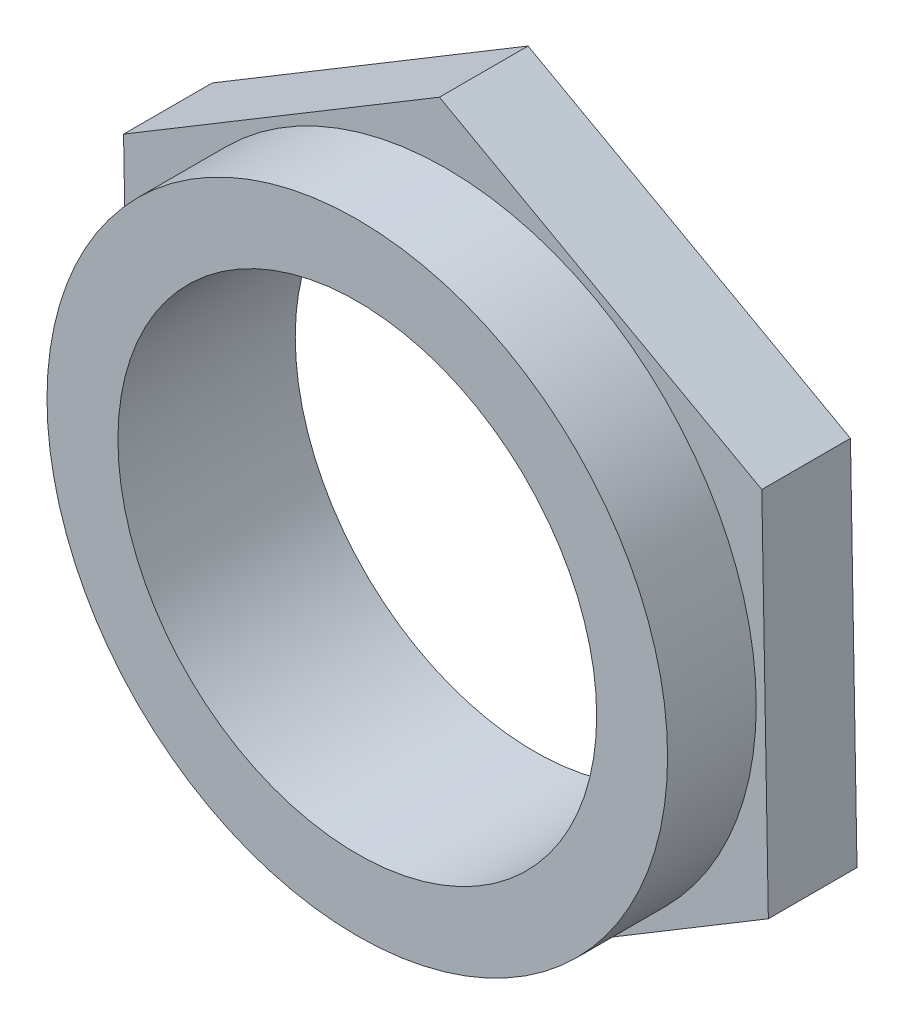
ISO-10303-21;
HEADER;
FILE_DESCRIPTION(('STEP AP214'),'2;1');
FILE_NAME('part.step','',(''),(''),'','','');
FILE_SCHEMA(('AUTOMOTIVE_DESIGN { 1 0 10303 214 1 1 1 1 }'));
ENDSEC;
DATA;
#1=APPLICATION_CONTEXT('core data for automotive mechanical design processes');
#2=APPLICATION_PROTOCOL_DEFINITION('international standard','automotive_design',2000,#1);
#3=PRODUCT_CONTEXT('',#1,'mechanical');
#4=PRODUCT('Part','Part','',(#3));
#5=PRODUCT_RELATED_PRODUCT_CATEGORY('part','',(#4));
#6=PRODUCT_DEFINITION_FORMATION('','',#4);
#7=PRODUCT_DEFINITION_CONTEXT('part definition',#1,'design');
#8=PRODUCT_DEFINITION('design','',#6,#7);
#9=PRODUCT_DEFINITION_SHAPE('','',#8);
#10=(LENGTH_UNIT() NAMED_UNIT(*) SI_UNIT(.MILLI.,.METRE.));
#11=(NAMED_UNIT(*) PLANE_ANGLE_UNIT() SI_UNIT($,.RADIAN.));
#12=(NAMED_UNIT(*) SI_UNIT($,.STERADIAN.) SOLID_ANGLE_UNIT());
#13=UNCERTAINTY_MEASURE_WITH_UNIT(LENGTH_MEASURE(1.E-05),#10,'distance_accuracy_value','');
#14=(GEOMETRIC_REPRESENTATION_CONTEXT(3) GLOBAL_UNCERTAINTY_ASSIGNED_CONTEXT((#13)) GLOBAL_UNIT_ASSIGNED_CONTEXT((#10,
#11,#12)) REPRESENTATION_CONTEXT('',''));
#15=CARTESIAN_POINT('',(0.,0.,0.));
#16=DIRECTION('',(0.,0.,1.));
#17=DIRECTION('',(1.,0.,0.));
#18=AXIS2_PLACEMENT_3D('',#15,#16,#17);
#19=CARTESIAN_POINT('',(-7.27266414408852,4.0284434025178,2.));
#20=DIRECTION('',(0.,0.,1.));
#21=DIRECTION('',(1.,0.,0.));
#22=AXIS2_PLACEMENT_3D('',#19,#20,#21);
#23=PLANE('',#22);
#24=DIRECTION('',(-0.857012292065942,-0.515295964711426,0.));
#25=VECTOR('',#24,1.);
#26=CARTESIAN_POINT('',(-0.147597747756021,8.31253360323177,2.));
#27=LINE('',#26,#25);
#28=CARTESIAN_POINT('',(-0.147597747756021,8.31253360323177,2.));
#29=VERTEX_POINT('',#28);
#30=CARTESIAN_POINT('',(-7.27266414408852,4.0284434025178,2.));
#31=VERTEX_POINT('',#30);
#32=EDGE_CURVE('E127',#29,#31,#27,.T.);
#33=ORIENTED_EDGE('',*,*,#32,.T.);
#34=DIRECTION('',(0.0177532498747338,-0.999842398640348,0.));
#35=VECTOR('',#34,1.);
#36=CARTESIAN_POINT('',(-7.27266414408852,4.0284434025178,2.));
#37=LINE('',#36,#35);
#38=CARTESIAN_POINT('',(-7.1250663963325,-4.28409020071397,2.));
#39=VERTEX_POINT('',#38);
#40=EDGE_CURVE('E85',#31,#39,#37,.T.);
#41=ORIENTED_EDGE('',*,*,#40,.T.);
#42=DIRECTION('',(0.874765541940676,-0.484546433928922,0.));
#43=VECTOR('',#42,1.);
#44=CARTESIAN_POINT('',(-7.1250663963325,-4.28409020071397,2.));
#45=LINE('',#44,#43);
#46=CARTESIAN_POINT('',(0.147597747756022,-8.31253360323177,2.));
#47=VERTEX_POINT('',#46);
#48=EDGE_CURVE('E98',#39,#47,#45,.T.);
#49=ORIENTED_EDGE('',*,*,#48,.T.);
#50=DIRECTION('',(0.857012292065942,0.515295964711427,0.));
#51=VECTOR('',#50,1.);
#52=CARTESIAN_POINT('',(0.147597747756022,-8.31253360323177,2.));
#53=LINE('',#52,#51);
#54=CARTESIAN_POINT('',(7.27266414408852,-4.0284434025178,2.));
#55=VERTEX_POINT('',#54);
#56=EDGE_CURVE('E92',#47,#55,#53,.T.);
#57=ORIENTED_EDGE('',*,*,#56,.T.);
#58=DIRECTION('',(-0.0177532498747337,0.999842398640348,0.));
#59=VECTOR('',#58,1.);
#60=CARTESIAN_POINT('',(7.27266414408852,-4.0284434025178,2.));
#61=LINE('',#60,#59);
#62=CARTESIAN_POINT('',(7.12506639633249,4.28409020071397,2.));
#63=VERTEX_POINT('',#62);
#64=EDGE_CURVE('E96',#55,#63,#61,.T.);
#65=ORIENTED_EDGE('',*,*,#64,.T.);
#66=DIRECTION('',(-0.874765541940676,0.484546433928922,0.));
#67=VECTOR('',#66,1.);
#68=CARTESIAN_POINT('',(7.12506639633249,4.28409020071397,2.));
#69=LINE('',#68,#67);
#70=EDGE_CURVE('E48',#63,#29,#69,.T.);
#71=ORIENTED_EDGE('',*,*,#70,.T.);
#72=EDGE_LOOP('',(#33,#41,#49,#57,#65,#71));
#73=FACE_BOUND('',#72,.T.);
#74=CARTESIAN_POINT('',(0.,0.,2.));
#75=DIRECTION('',(0.,0.,1.));
#76=DIRECTION('',(1.,0.,0.));
#77=AXIS2_PLACEMENT_3D('',#74,#75,#76);
#78=CIRCLE('',#77,7.);
#79=CARTESIAN_POINT('',(7.,0.,2.));
#80=VERTEX_POINT('',#79);
#81=EDGE_CURVE('E177',#80,#80,#78,.T.);
#82=ORIENTED_EDGE('',*,*,#81,.F.);
#83=EDGE_LOOP('',(#82));
#84=FACE_BOUND('',#83,.T.);
#85=ADVANCED_FACE('F31',(#73,#84),#23,.T.);
#86=CARTESIAN_POINT('',(-0.147597747756021,8.31253360323177,2.));
#87=DIRECTION('',(0.515295964711427,-0.857012292065943,0.));
#88=DIRECTION('',(0.857012292065943,0.515295964711427,0.));
#89=AXIS2_PLACEMENT_3D('',#86,#87,#88);
#90=PLANE('',#89);
#91=DIRECTION('',(-0.857012292065942,-0.515295964711426,0.));
#92=VECTOR('',#91,1.);
#93=CARTESIAN_POINT('',(-0.147597747756021,8.31253360323177,0.));
#94=LINE('',#93,#92);
#95=CARTESIAN_POINT('',(-0.147597747756021,8.31253360323177,0.));
#96=VERTEX_POINT('',#95);
#97=CARTESIAN_POINT('',(-7.27266414408852,4.0284434025178,0.));
#98=VERTEX_POINT('',#97);
#99=EDGE_CURVE('E116',#96,#98,#94,.T.);
#100=ORIENTED_EDGE('',*,*,#99,.T.);
#101=DIRECTION('',(0.,0.,-1.));
#102=VECTOR('',#101,1.);
#103=CARTESIAN_POINT('',(-7.27266414408852,4.0284434025178,2.));
#104=LINE('',#103,#102);
#105=EDGE_CURVE('E11',#31,#98,#104,.T.);
#106=ORIENTED_EDGE('',*,*,#105,.F.);
#107=ORIENTED_EDGE('',*,*,#32,.F.);
#108=DIRECTION('',(0.,0.,-1.));
#109=VECTOR('',#108,1.);
#110=CARTESIAN_POINT('',(-0.147597747756021,8.31253360323177,2.));
#111=LINE('',#110,#109);
#112=EDGE_CURVE('E112',#29,#96,#111,.T.);
#113=ORIENTED_EDGE('',*,*,#112,.T.);
#114=EDGE_LOOP('',(#100,#106,#107,#113));
#115=FACE_BOUND('',#114,.T.);
#116=ADVANCED_FACE('F33',(#115),#90,.F.);
#117=CARTESIAN_POINT('',(-7.27266414408852,4.0284434025178,2.));
#118=DIRECTION('',(0.999842398640348,0.0177532498747338,0.));
#119=DIRECTION('',(-0.0177532498747338,0.999842398640348,0.));
#120=AXIS2_PLACEMENT_3D('',#117,#118,#119);
#121=PLANE('',#120);
#122=DIRECTION('',(0.0177532498747338,-0.999842398640348,0.));
#123=VECTOR('',#122,1.);
#124=CARTESIAN_POINT('',(-7.27266414408852,4.0284434025178,0.));
#125=LINE('',#124,#123);
#126=CARTESIAN_POINT('',(-7.1250663963325,-4.28409020071397,0.));
#127=VERTEX_POINT('',#126);
#128=EDGE_CURVE('E119',#98,#127,#125,.T.);
#129=ORIENTED_EDGE('',*,*,#128,.T.);
#130=DIRECTION('',(0.,0.,-1.));
#131=VECTOR('',#130,1.);
#132=CARTESIAN_POINT('',(-7.1250663963325,-4.28409020071397,2.));
#133=LINE('',#132,#131);
#134=EDGE_CURVE('E40',#39,#127,#133,.T.);
#135=ORIENTED_EDGE('',*,*,#134,.F.);
#136=ORIENTED_EDGE('',*,*,#40,.F.);
#137=ORIENTED_EDGE('',*,*,#105,.T.);
#138=EDGE_LOOP('',(#129,#135,#136,#137));
#139=FACE_BOUND('',#138,.T.);
#140=ADVANCED_FACE('F156',(#139),#121,.F.);
#141=CARTESIAN_POINT('',(-7.1250663963325,-4.28409020071397,2.));
#142=DIRECTION('',(0.484546433928922,0.874765541940676,0.));
#143=DIRECTION('',(-0.874765541940676,0.484546433928922,0.));
#144=AXIS2_PLACEMENT_3D('',#141,#142,#143);
#145=PLANE('',#144);
#146=DIRECTION('',(0.874765541940676,-0.484546433928922,0.));
#147=VECTOR('',#146,1.);
#148=CARTESIAN_POINT('',(-7.1250663963325,-4.28409020071397,0.));
#149=LINE('',#148,#147);
#150=CARTESIAN_POINT('',(0.147597747756022,-8.31253360323177,0.));
#151=VERTEX_POINT('',#150);
#152=EDGE_CURVE('E122',#127,#151,#149,.T.);
#153=ORIENTED_EDGE('',*,*,#152,.T.);
#154=DIRECTION('',(0.,0.,-1.));
#155=VECTOR('',#154,1.);
#156=CARTESIAN_POINT('',(0.147597747756022,-8.31253360323177,2.));
#157=LINE('',#156,#155);
#158=EDGE_CURVE('E107',#47,#151,#157,.T.);
#159=ORIENTED_EDGE('',*,*,#158,.F.);
#160=ORIENTED_EDGE('',*,*,#48,.F.);
#161=ORIENTED_EDGE('',*,*,#134,.T.);
#162=EDGE_LOOP('',(#153,#159,#160,#161));
#163=FACE_BOUND('',#162,.T.);
#164=ADVANCED_FACE('F133',(#163),#145,.F.);
#165=CARTESIAN_POINT('',(0.147597747756022,-8.31253360323177,2.));
#166=DIRECTION('',(-0.515295964711427,0.857012292065943,0.));
#167=DIRECTION('',(-0.857012292065943,-0.515295964711427,0.));
#168=AXIS2_PLACEMENT_3D('',#165,#166,#167);
#169=PLANE('',#168);
#170=DIRECTION('',(0.857012292065942,0.515295964711427,0.));
#171=VECTOR('',#170,1.);
#172=CARTESIAN_POINT('',(0.147597747756022,-8.31253360323177,0.));
#173=LINE('',#172,#171);
#174=CARTESIAN_POINT('',(7.27266414408852,-4.0284434025178,0.));
#175=VERTEX_POINT('',#174);
#176=EDGE_CURVE('E106',#151,#175,#173,.T.);
#177=ORIENTED_EDGE('',*,*,#176,.T.);
#178=DIRECTION('',(0.,0.,-1.));
#179=VECTOR('',#178,1.);
#180=CARTESIAN_POINT('',(7.27266414408852,-4.0284434025178,2.));
#181=LINE('',#180,#179);
#182=EDGE_CURVE('E103',#55,#175,#181,.T.);
#183=ORIENTED_EDGE('',*,*,#182,.F.);
#184=ORIENTED_EDGE('',*,*,#56,.F.);
#185=ORIENTED_EDGE('',*,*,#158,.T.);
#186=EDGE_LOOP('',(#177,#183,#184,#185));
#187=FACE_BOUND('',#186,.T.);
#188=ADVANCED_FACE('F104',(#187),#169,.F.);
#189=CARTESIAN_POINT('',(7.27266414408852,-4.0284434025178,2.));
#190=DIRECTION('',(-0.999842398640348,-0.0177532498747337,0.));
#191=DIRECTION('',(0.0177532498747337,-0.999842398640349,0.));
#192=AXIS2_PLACEMENT_3D('',#189,#190,#191);
#193=PLANE('',#192);
#194=DIRECTION('',(-0.0177532498747337,0.999842398640348,0.));
#195=VECTOR('',#194,1.);
#196=CARTESIAN_POINT('',(7.27266414408852,-4.0284434025178,0.));
#197=LINE('',#196,#195);
#198=CARTESIAN_POINT('',(7.12506639633249,4.28409020071397,0.));
#199=VERTEX_POINT('',#198);
#200=EDGE_CURVE('E71',#175,#199,#197,.T.);
#201=ORIENTED_EDGE('',*,*,#200,.T.);
#202=DIRECTION('',(0.,0.,-1.));
#203=VECTOR('',#202,1.);
#204=CARTESIAN_POINT('',(7.12506639633249,4.28409020071397,2.));
#205=LINE('',#204,#203);
#206=EDGE_CURVE('E108',#63,#199,#205,.T.);
#207=ORIENTED_EDGE('',*,*,#206,.F.);
#208=ORIENTED_EDGE('',*,*,#64,.F.);
#209=ORIENTED_EDGE('',*,*,#182,.T.);
#210=EDGE_LOOP('',(#201,#207,#208,#209));
#211=FACE_BOUND('',#210,.T.);
#212=ADVANCED_FACE('F110',(#211),#193,.F.);
#213=CARTESIAN_POINT('',(7.12506639633249,4.28409020071397,2.));
#214=DIRECTION('',(-0.484546433928922,-0.874765541940676,0.));
#215=DIRECTION('',(0.874765541940676,-0.484546433928922,0.));
#216=AXIS2_PLACEMENT_3D('',#213,#214,#215);
#217=PLANE('',#216);
#218=DIRECTION('',(-0.874765541940676,0.484546433928922,0.));
#219=VECTOR('',#218,1.);
#220=CARTESIAN_POINT('',(7.12506639633249,4.28409020071397,0.));
#221=LINE('',#220,#219);
#222=EDGE_CURVE('E77',#199,#96,#221,.T.);
#223=ORIENTED_EDGE('',*,*,#222,.T.);
#224=ORIENTED_EDGE('',*,*,#112,.F.);
#225=ORIENTED_EDGE('',*,*,#70,.F.);
#226=ORIENTED_EDGE('',*,*,#206,.T.);
#227=EDGE_LOOP('',(#223,#224,#225,#226));
#228=FACE_BOUND('',#227,.T.);
#229=ADVANCED_FACE('F140',(#228),#217,.F.);
#230=CARTESIAN_POINT('',(-7.27266414408852,4.0284434025178,0.));
#231=DIRECTION('',(0.,0.,1.));
#232=DIRECTION('',(1.,0.,0.));
#233=AXIS2_PLACEMENT_3D('',#230,#231,#232);
#234=PLANE('',#233);
#235=CARTESIAN_POINT('',(0.,0.,0.));
#236=DIRECTION('',(0.,0.,1.));
#237=DIRECTION('',(1.,0.,0.));
#238=AXIS2_PLACEMENT_3D('',#235,#236,#237);
#239=CIRCLE('',#238,5.39999999999999);
#240=CARTESIAN_POINT('',(5.39999999999999,0.,0.));
#241=VERTEX_POINT('',#240);
#242=EDGE_CURVE('E176',#241,#241,#239,.T.);
#243=ORIENTED_EDGE('',*,*,#242,.T.);
#244=EDGE_LOOP('',(#243));
#245=FACE_BOUND('',#244,.T.);
#246=ORIENTED_EDGE('',*,*,#99,.F.);
#247=ORIENTED_EDGE('',*,*,#222,.F.);
#248=ORIENTED_EDGE('',*,*,#200,.F.);
#249=ORIENTED_EDGE('',*,*,#176,.F.);
#250=ORIENTED_EDGE('',*,*,#152,.F.);
#251=ORIENTED_EDGE('',*,*,#128,.F.);
#252=EDGE_LOOP('',(#246,#247,#248,#249,#250,#251));
#253=FACE_BOUND('',#252,.T.);
#254=ADVANCED_FACE('F136',(#245,#253),#234,.F.);
#255=CARTESIAN_POINT('',(0.,0.,4.));
#256=DIRECTION('',(0.,0.,-1.));
#257=DIRECTION('',(-1.,0.,0.));
#258=AXIS2_PLACEMENT_3D('',#255,#256,#257);
#259=CYLINDRICAL_SURFACE('',#258,7.);
#260=CARTESIAN_POINT('',(0.,0.,4.));
#261=DIRECTION('',(0.,0.,1.));
#262=DIRECTION('',(1.,0.,0.));
#263=AXIS2_PLACEMENT_3D('',#260,#261,#262);
#264=CIRCLE('',#263,7.);
#265=CARTESIAN_POINT('',(7.,0.,4.));
#266=VERTEX_POINT('',#265);
#267=EDGE_CURVE('E120',#266,#266,#264,.T.);
#268=ORIENTED_EDGE('',*,*,#267,.F.);
#269=EDGE_LOOP('',(#268));
#270=FACE_BOUND('',#269,.T.);
#271=ORIENTED_EDGE('',*,*,#81,.T.);
#272=EDGE_LOOP('',(#271));
#273=FACE_BOUND('',#272,.T.);
#274=ADVANCED_FACE('F147',(#270,#273),#259,.T.);
#275=CARTESIAN_POINT('',(0.,0.,4.));
#276=DIRECTION('',(0.,0.,1.));
#277=DIRECTION('',(1.,0.,0.));
#278=AXIS2_PLACEMENT_3D('',#275,#276,#277);
#279=PLANE('',#278);
#280=CARTESIAN_POINT('',(0.,0.,4.));
#281=DIRECTION('',(0.,0.,1.));
#282=DIRECTION('',(1.,0.,0.));
#283=AXIS2_PLACEMENT_3D('',#280,#281,#282);
#284=CIRCLE('',#283,5.39999999999999);
#285=CARTESIAN_POINT('',(5.39999999999999,0.,4.));
#286=VERTEX_POINT('',#285);
#287=EDGE_CURVE('E173',#286,#286,#284,.T.);
#288=ORIENTED_EDGE('',*,*,#287,.F.);
#289=EDGE_LOOP('',(#288));
#290=FACE_BOUND('',#289,.T.);
#291=ORIENTED_EDGE('',*,*,#267,.T.);
#292=EDGE_LOOP('',(#291));
#293=FACE_BOUND('',#292,.T.);
#294=ADVANCED_FACE('F160',(#290,#293),#279,.T.);
#295=CARTESIAN_POINT('',(0.,0.,4.));
#296=DIRECTION('',(0.,0.,1.));
#297=DIRECTION('',(1.,0.,0.));
#298=AXIS2_PLACEMENT_3D('',#295,#296,#297);
#299=CYLINDRICAL_SURFACE('',#298,5.39999999999999);
#300=ORIENTED_EDGE('',*,*,#287,.T.);
#301=EDGE_LOOP('',(#300));
#302=FACE_BOUND('',#301,.T.);
#303=ORIENTED_EDGE('',*,*,#242,.F.);
#304=EDGE_LOOP('',(#303));
#305=FACE_BOUND('',#304,.T.);
#306=ADVANCED_FACE('F164',(#302,#305),#299,.F.);
#307=CLOSED_SHELL('',(#85,#116,#140,#164,#188,#212,#229,#254,#274,#294,#306));
#308=MANIFOLD_SOLID_BREP('B2',#307);
#309=ADVANCED_BREP_SHAPE_REPRESENTATION('',(#18,#308),#14);
#310=SHAPE_DEFINITION_REPRESENTATION(#9,#309);
ENDSEC;
END-ISO-10303-21;
